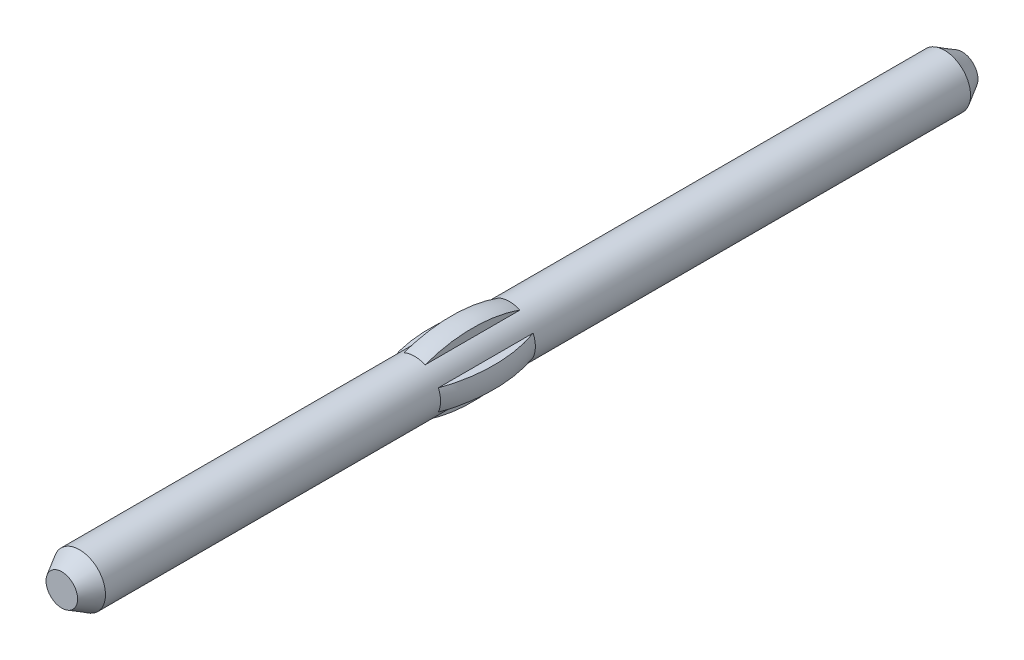
ISO-10303-21;
HEADER;
FILE_DESCRIPTION(('STEP AP214'),'2;1');
FILE_NAME('part.step','',(''),(''),'','','');
FILE_SCHEMA(('AUTOMOTIVE_DESIGN { 1 0 10303 214 1 1 1 1 }'));
ENDSEC;
DATA;
#1=APPLICATION_CONTEXT('core data for automotive mechanical design processes');
#2=APPLICATION_PROTOCOL_DEFINITION('international standard','automotive_design',2000,#1);
#3=PRODUCT_CONTEXT('',#1,'mechanical');
#4=PRODUCT('Part','Part','',(#3));
#5=PRODUCT_RELATED_PRODUCT_CATEGORY('part','',(#4));
#6=PRODUCT_DEFINITION_FORMATION('','',#4);
#7=PRODUCT_DEFINITION_CONTEXT('part definition',#1,'design');
#8=PRODUCT_DEFINITION('design','',#6,#7);
#9=PRODUCT_DEFINITION_SHAPE('','',#8);
#10=(LENGTH_UNIT() NAMED_UNIT(*) SI_UNIT(.MILLI.,.METRE.));
#11=(NAMED_UNIT(*) PLANE_ANGLE_UNIT() SI_UNIT($,.RADIAN.));
#12=(NAMED_UNIT(*) SI_UNIT($,.STERADIAN.) SOLID_ANGLE_UNIT());
#13=UNCERTAINTY_MEASURE_WITH_UNIT(LENGTH_MEASURE(1.E-05),#10,'distance_accuracy_value','');
#14=(GEOMETRIC_REPRESENTATION_CONTEXT(3) GLOBAL_UNCERTAINTY_ASSIGNED_CONTEXT((#13)) GLOBAL_UNIT_ASSIGNED_CONTEXT((#10,
#11,#12)) REPRESENTATION_CONTEXT('',''));
#15=CARTESIAN_POINT('',(0.,0.,0.));
#16=DIRECTION('',(0.,0.,1.));
#17=DIRECTION('',(1.,0.,0.));
#18=AXIS2_PLACEMENT_3D('',#15,#16,#17);
#19=CARTESIAN_POINT('',(96.225905319361,108.90011364552,5.31278614958));
#20=DIRECTION('',(1.74845553146897E-07,-0.999999999999984,-4.37114091299593E-08));
#21=DIRECTION('',(0.,4.37114091299599E-08,-1.));
#22=AXIS2_PLACEMENT_3D('',#19,#20,#21);
#23=PLANE('',#22);
#24=CARTESIAN_POINT('',(96.2259053193604,108.900113791951,1.96278614958001));
#25=CARTESIAN_POINT('',(96.22590531936,108.900113805067,1.66278614958));
#26=CARTESIAN_POINT('',(96.22590531936,108.90011381818,1.36278614958));
#27=CARTESIAN_POINT('',(96.2259053193607,108.900113831291,1.06278614957979));
#28=(BOUNDED_CURVE() B_SPLINE_CURVE(3,(#24,#25,#26,#27),.UNSPECIFIED.,.F.,
.F.) B_SPLINE_CURVE_WITH_KNOTS((4,4),(0.,1.),
.UNSPECIFIED.) CURVE() GEOMETRIC_REPRESENTATION_ITEM() RATIONAL_B_SPLINE_CURVE((1.,1.,1.,1.)) REPRESENTATION_ITEM(''));
#29=CARTESIAN_POINT('',(96.2259053193504,108.900113791954,1.96278614957638));
#30=VERTEX_POINT('',#29);
#31=CARTESIAN_POINT('',(96.2259053193456,108.900113831295,1.0627861495853));
#32=VERTEX_POINT('',#31);
#33=EDGE_CURVE('E28',#30,#32,#28,.T.);
#34=ORIENTED_EDGE('',*,*,#33,.T.);
#35=CARTESIAN_POINT('',(96.2259053193448,108.900113831293,1.06278614958558));
#36=CARTESIAN_POINT('',(96.2367600853112,108.900113831888,1.09260813590346));
#37=CARTESIAN_POINT('',(96.2464601385901,108.900113832263,1.12283126490756));
#38=CARTESIAN_POINT('',(96.2635854640539,108.900113832587,1.18390823471383));
#39=CARTESIAN_POINT('',(96.2710112975785,108.900113832537,1.21476191786905));
#40=CARTESIAN_POINT('',(96.2899430468077,108.900113831769,1.30806587721575));
#41=CARTESIAN_POINT('',(96.2980921656266,108.900113830433,1.37122817609962));
#42=CARTESIAN_POINT('',(96.3054365590262,108.900113826177,1.49797331769546));
#43=CARTESIAN_POINT('',(96.3046404848963,108.900113823258,1.56155569464625));
#44=CARTESIAN_POINT('',(96.2941234025157,108.900113815895,1.68792604610423));
#45=CARTESIAN_POINT('',(96.2844155328806,108.900113811453,1.75071505216087));
#46=CARTESIAN_POINT('',(96.2643935869055,108.90011380414,1.83792743388448));
#47=CARTESIAN_POINT('',(96.2577787954918,108.900113801877,1.86324096945574));
#48=CARTESIAN_POINT('',(96.243005887126,108.900113797102,1.91338924516118));
#49=CARTESIAN_POINT('',(96.2348491111923,108.900113794591,1.93822438081877));
#50=CARTESIAN_POINT('',(96.22590531935,108.900113791953,1.96278614957624));
#51=B_SPLINE_CURVE_WITH_KNOTS('',3,(#35,#36,#37,#38,#39,#40,#41,#42,#43,#44,#45,#46,#47,#48,#49,
#50),.UNSPECIFIED.,.F.,.F.,(4,2,2,2,2,2,2,4),(0.,0.0951523064873538,0.190281107811415,
0.38063618983316,0.570807186945313,0.760698265395729,0.839148426841913,0.917530673783877),.UNSPECIFIED.);
#52=EDGE_CURVE('E11',#32,#30,#51,.T.);
#53=ORIENTED_EDGE('',*,*,#52,.T.);
#54=EDGE_LOOP('',(#34,#53));
#55=FACE_BOUND('',#54,.T.);
#56=ADVANCED_FACE('F17',(#55),#23,.T.);
#57=CARTESIAN_POINT('',(96.0000535805985,109.000113772118,1.51278615395875));
#58=DIRECTION('',(-1.31218786265574E-12,4.37095438395527E-08,-1.));
#59=DIRECTION('',(0.,1.,4.37095438395528E-08));
#60=AXIS2_PLACEMENT_3D('',#57,#58,#59);
#61=DEGENERATE_TOROIDAL_SURFACE('',#60,1.10348630137945,1.42348630136758,.F.);
#62=CARTESIAN_POINT('',(96.0000535805979,109.000113791787,1.06278615395839));
#63=DIRECTION('',(-1.31218786265574E-12,4.37095438395527E-08,-1.));
#64=DIRECTION('',(0.,0.999999999999999,4.37095438395527E-08));
#65=AXIS2_PLACEMENT_3D('',#62,#63,#64);
#66=CIRCLE('',#65,0.246999999987888);
#67=CARTESIAN_POINT('',(96.225905284365,109.100113831287,1.06278615833173));
#68=VERTEX_POINT('',#67);
#69=EDGE_CURVE('E43',#32,#68,#66,.F.);
#70=ORIENTED_EDGE('',*,*,#69,.T.);
#71=CARTESIAN_POINT('',(96.2259052843625,109.100113831293,1.06278615833265));
#72=CARTESIAN_POINT('',(96.2367600503295,109.100113831888,1.0926081446507));
#73=CARTESIAN_POINT('',(96.246460103609,109.100113832263,1.12283127365503));
#74=CARTESIAN_POINT('',(96.2635854290736,109.100113832587,1.18390824346185));
#75=CARTESIAN_POINT('',(96.2710112625985,109.100113832537,1.21476192661739));
#76=CARTESIAN_POINT('',(96.2899430118284,109.100113831769,1.30806588596514));
#77=CARTESIAN_POINT('',(96.2980921306474,109.100113830433,1.37122818484981));
#78=CARTESIAN_POINT('',(96.3054365240467,109.100113826177,1.49797332644717));
#79=CARTESIAN_POINT('',(96.3046404499162,109.100113823258,1.56155570339868));
#80=CARTESIAN_POINT('',(96.2941233675343,109.100113815895,1.68792605485795));
#81=CARTESIAN_POINT('',(96.2844154978982,109.100113811453,1.75071506091516));
#82=CARTESIAN_POINT('',(96.2643935519221,109.10011380414,1.83792744263628));
#83=CARTESIAN_POINT('',(96.2577787605086,109.100113801877,1.86324097820467));
#84=CARTESIAN_POINT('',(96.2430058521437,109.100113797102,1.91338925390439));
#85=CARTESIAN_POINT('',(96.2348490762105,109.100113794591,1.93822438955915));
#86=CARTESIAN_POINT('',(96.2259052843689,109.100113791953,1.9627861583138));
#87=B_SPLINE_CURVE_WITH_KNOTS('',3,(#71,#72,#73,#74,#75,#76,#77,#78,#79,#80,#81,#82,#83,#84,#85,
#86),.UNSPECIFIED.,.F.,.F.,(4,2,2,2,2,2,2,4),(0.,0.0951523064884941,0.190281107813681,
0.380636189837757,0.57080718695203,0.760698265404483,0.839148426842087,0.917530673775471),.UNSPECIFIED.);
#88=CARTESIAN_POINT('',(96.2259052843711,109.100113791948,1.96278615831458));
#89=VERTEX_POINT('',#88);
#90=EDGE_CURVE('E176',#68,#89,#87,.T.);
#91=ORIENTED_EDGE('',*,*,#90,.T.);
#92=CARTESIAN_POINT('',(96.0000535805991,109.000113752449,1.9627861539447));
#93=DIRECTION('',(-1.31218786265574E-12,4.37095438395527E-08,-1.));
#94=DIRECTION('',(0.,0.999999999999999,4.37095438395527E-08));
#95=AXIS2_PLACEMENT_3D('',#92,#93,#94);
#96=CIRCLE('',#95,0.246999999992688);
#97=EDGE_CURVE('E297',#89,#30,#96,.T.);
#98=ORIENTED_EDGE('',*,*,#97,.T.);
#99=ORIENTED_EDGE('',*,*,#52,.F.);
#100=EDGE_LOOP('',(#70,#91,#98,#99));
#101=FACE_BOUND('',#100,.T.);
#102=ADVANCED_FACE('F183',(#101),#61,.F.);
#103=CARTESIAN_POINT('',(96.225905284391,109.10011364552,5.312786158322));
#104=DIRECTION('',(1.74845553146897E-07,-0.999999999999984,-4.37114091299593E-08));
#105=DIRECTION('',(0.,4.37114091299599E-08,-1.));
#106=AXIS2_PLACEMENT_3D('',#103,#104,#105);
#107=PLANE('',#106);
#108=ORIENTED_EDGE('',*,*,#90,.F.);
#109=CARTESIAN_POINT('',(96.2259052843906,109.10011379195,1.9627861583217));
#110=CARTESIAN_POINT('',(96.225905284391,109.100113805067,1.662786158322));
#111=CARTESIAN_POINT('',(96.225905284391,109.10011381818,1.362786158322));
#112=CARTESIAN_POINT('',(96.2259052843908,109.100113831291,1.06278615832233));
#113=(BOUNDED_CURVE() B_SPLINE_CURVE(3,(#109,#110,#111,#112),.UNSPECIFIED.,.F.,
.F.) B_SPLINE_CURVE_WITH_KNOTS((4,4),(0.,1.),
.UNSPECIFIED.) CURVE() GEOMETRIC_REPRESENTATION_ITEM() RATIONAL_B_SPLINE_CURVE((1.,1.,1.,1.)) REPRESENTATION_ITEM(''));
#114=EDGE_CURVE('E301',#89,#68,#113,.T.);
#115=ORIENTED_EDGE('',*,*,#114,.F.);
#116=EDGE_LOOP('',(#108,#115));
#117=FACE_BOUND('',#116,.T.);
#118=ADVANCED_FACE('F186',(#117),#107,.F.);
#119=CARTESIAN_POINT('',(96.000053580607,109.00011358734,5.740286153951));
#120=DIRECTION('',(0.,4.37114091299598E-08,-1.));
#121=DIRECTION('',(-0.999999999999985,-1.74845574366145E-07,0.));
#122=AXIS2_PLACEMENT_3D('',#119,#120,#121);
#123=CYLINDRICAL_SURFACE('',#122,0.247);
#124=ORIENTED_EDGE('',*,*,#69,.F.);
#125=ORIENTED_EDGE('',*,*,#33,.F.);
#126=ORIENTED_EDGE('',*,*,#97,.F.);
#127=ORIENTED_EDGE('',*,*,#114,.T.);
#128=EDGE_LOOP('',(#124,#125,#126,#127));
#129=FACE_BOUND('',#128,.T.);
#130=CARTESIAN_POINT('',(96.0000535806069,109.000113972415,-3.069204917715));
#131=DIRECTION('',(0.,4.37114091299598E-08,-1.));
#132=DIRECTION('',(0.,0.999999999999999,4.37114091299598E-08));
#133=AXIS2_PLACEMENT_3D('',#130,#131,#132);
#134=CIRCLE('',#133,0.247);
#135=CARTESIAN_POINT('',(96.0000535806069,109.247113972415,-3.06920490691828));
#136=VERTEX_POINT('',#135);
#137=EDGE_CURVE('E131',#136,#136,#134,.F.);
#138=ORIENTED_EDGE('',*,*,#137,.T.);
#139=EDGE_LOOP('',(#138));
#140=FACE_BOUND('',#139,.T.);
#141=CARTESIAN_POINT('',(96.000053580607,109.00011375246,1.9627861539508));
#142=DIRECTION('',(0.,4.37114091299598E-08,-1.));
#143=DIRECTION('',(0.,0.999999999999999,4.37114091299598E-08));
#144=AXIS2_PLACEMENT_3D('',#141,#142,#143);
#145=CIRCLE('',#144,0.247);
#146=CARTESIAN_POINT('',(95.7742018418576,109.100113712972,1.96278615832066));
#147=VERTEX_POINT('',#146);
#148=CARTESIAN_POINT('',(95.7742018768222,108.900113712972,1.96278614957984));
#149=VERTEX_POINT('',#148);
#150=EDGE_CURVE('E104',#147,#149,#145,.F.);
#151=ORIENTED_EDGE('',*,*,#150,.T.);
#152=CARTESIAN_POINT('',(95.7742018768225,108.900113712971,1.96278614958012));
#153=CARTESIAN_POINT('',(95.774201876823,108.900113726087,1.66278614958));
#154=CARTESIAN_POINT('',(95.774201876823,108.9001137392,1.36278614958));
#155=CARTESIAN_POINT('',(95.774201876823,108.900113752311,1.06278614957994));
#156=(BOUNDED_CURVE() B_SPLINE_CURVE(3,(#152,#153,#154,#155),.UNSPECIFIED.,.F.,
.F.) B_SPLINE_CURVE_WITH_KNOTS((4,4),(0.,1.),
.UNSPECIFIED.) CURVE() GEOMETRIC_REPRESENTATION_ITEM() RATIONAL_B_SPLINE_CURVE((1.,1.,1.,1.)) REPRESENTATION_ITEM(''));
#157=CARTESIAN_POINT('',(95.7742018768224,108.900113752312,1.06278614957993));
#158=VERTEX_POINT('',#157);
#159=EDGE_CURVE('E118',#149,#158,#156,.T.);
#160=ORIENTED_EDGE('',*,*,#159,.T.);
#161=CARTESIAN_POINT('',(96.000053580607,109.0001137918,1.062786153951));
#162=DIRECTION('',(0.,4.37114091299598E-08,-1.));
#163=DIRECTION('',(0.,0.999999999999999,4.37114091299598E-08));
#164=AXIS2_PLACEMENT_3D('',#161,#162,#163);
#165=CIRCLE('',#164,0.247);
#166=CARTESIAN_POINT('',(95.7742018418601,109.100113752313,1.06278615832432));
#167=VERTEX_POINT('',#166);
#168=EDGE_CURVE('E112',#158,#167,#165,.T.);
#169=ORIENTED_EDGE('',*,*,#168,.T.);
#170=CARTESIAN_POINT('',(95.7742018418537,109.100113752312,1.062786158322));
#171=CARTESIAN_POINT('',(95.774201841854,109.1001137392,1.362786158322));
#172=CARTESIAN_POINT('',(95.774201841854,109.100113726087,1.662786158322));
#173=CARTESIAN_POINT('',(95.7742018418542,109.100113712971,1.96278615832194));
#174=(BOUNDED_CURVE() B_SPLINE_CURVE(3,(#170,#171,#172,#173),.UNSPECIFIED.,.F.,
.F.) B_SPLINE_CURVE_WITH_KNOTS((4,4),(-1.,0.),
.UNSPECIFIED.) CURVE() GEOMETRIC_REPRESENTATION_ITEM() RATIONAL_B_SPLINE_CURVE((1.,1.,1.,1.)) REPRESENTATION_ITEM(''));
#175=EDGE_CURVE('E116',#167,#147,#174,.T.);
#176=ORIENTED_EDGE('',*,*,#175,.T.);
#177=EDGE_LOOP('',(#151,#160,#169,#176));
#178=FACE_BOUND('',#177,.T.);
#179=CARTESIAN_POINT('',(96.100053541118,109.225965530552,1.06278616382319));
#180=CARTESIAN_POINT('',(96.1000535411182,109.225965517437,1.362786163823));
#181=CARTESIAN_POINT('',(96.1000535411182,109.225965504323,1.662786163823));
#182=CARTESIAN_POINT('',(96.1000535411176,109.225965491211,1.96278616382265));
#183=(BOUNDED_CURVE() B_SPLINE_CURVE(3,(#179,#180,#181,#182),.UNSPECIFIED.,.F.,
.F.) B_SPLINE_CURVE_WITH_KNOTS((4,4),(0.,1.),
.UNSPECIFIED.) CURVE() GEOMETRIC_REPRESENTATION_ITEM() RATIONAL_B_SPLINE_CURVE((1.,1.,1.,1.)) REPRESENTATION_ITEM(''));
#184=CARTESIAN_POINT('',(96.1000535411181,109.225965530553,1.06278616382302));
#185=VERTEX_POINT('',#184);
#186=CARTESIAN_POINT('',(96.100053541118,109.225965491212,1.96278616382265));
#187=VERTEX_POINT('',#186);
#188=EDGE_CURVE('E158',#185,#187,#183,.T.);
#189=ORIENTED_EDGE('',*,*,#188,.T.);
#190=CARTESIAN_POINT('',(96.000053580607,109.00011375246,1.96278615395035));
#191=DIRECTION('',(0.,4.37114091299598E-08,-1.));
#192=DIRECTION('',(0.,0.999999999999999,4.37114091299598E-08));
#193=AXIS2_PLACEMENT_3D('',#190,#191,#192);
#194=CIRCLE('',#193,0.247);
#195=CARTESIAN_POINT('',(95.9000535411182,109.225965456236,1.96278616382043));
#196=VERTEX_POINT('',#195);
#197=EDGE_CURVE('E166',#187,#196,#194,.F.);
#198=ORIENTED_EDGE('',*,*,#197,.T.);
#199=CARTESIAN_POINT('',(95.9000535411175,109.225965456241,1.96278616382298));
#200=CARTESIAN_POINT('',(95.9000535411182,109.225965469353,1.662786163823));
#201=CARTESIAN_POINT('',(95.9000535411182,109.225965482467,1.362786163823));
#202=CARTESIAN_POINT('',(95.900053541117,109.225965495582,1.06278616382285));
#203=(BOUNDED_CURVE() B_SPLINE_CURVE(3,(#199,#200,#201,#202),.UNSPECIFIED.,.F.,
.F.) B_SPLINE_CURVE_WITH_KNOTS((4,4),(-1.,0.),
.UNSPECIFIED.) CURVE() GEOMETRIC_REPRESENTATION_ITEM() RATIONAL_B_SPLINE_CURVE((1.,1.,1.,1.)) REPRESENTATION_ITEM(''));
#204=CARTESIAN_POINT('',(95.9000535411182,109.225965495573,1.06278616382646));
#205=VERTEX_POINT('',#204);
#206=EDGE_CURVE('E148',#196,#205,#203,.T.);
#207=ORIENTED_EDGE('',*,*,#206,.T.);
#208=CARTESIAN_POINT('',(96.000053580607,109.0001137918,1.06278615395055));
#209=DIRECTION('',(0.,4.37114091299598E-08,-1.));
#210=DIRECTION('',(0.,0.999999999999999,4.37114091299598E-08));
#211=AXIS2_PLACEMENT_3D('',#208,#209,#210);
#212=CIRCLE('',#211,0.247);
#213=EDGE_CURVE('E255',#205,#185,#212,.T.);
#214=ORIENTED_EDGE('',*,*,#213,.T.);
#215=EDGE_LOOP('',(#189,#198,#207,#214));
#216=FACE_BOUND('',#215,.T.);
#217=CARTESIAN_POINT('',(96.000053580607,109.000113613371,5.14477722561698));
#218=DIRECTION('',(0.,4.37114091299598E-08,-1.));
#219=DIRECTION('',(0.,0.999999999999999,4.37114091299598E-08));
#220=AXIS2_PLACEMENT_3D('',#217,#218,#219);
#221=CIRCLE('',#220,0.247);
#222=CARTESIAN_POINT('',(96.000053580607,109.247113613371,5.1447772364137));
#223=VERTEX_POINT('',#222);
#224=EDGE_CURVE('E127',#223,#223,#221,.T.);
#225=ORIENTED_EDGE('',*,*,#224,.T.);
#226=EDGE_LOOP('',(#225));
#227=FACE_BOUND('',#226,.T.);
#228=CARTESIAN_POINT('',(96.1000536200969,108.774262048678,1.96278614407898));
#229=CARTESIAN_POINT('',(96.1000536200967,108.774262061793,1.662786144079));
#230=CARTESIAN_POINT('',(96.1000536200967,108.774262074907,1.362786144079));
#231=CARTESIAN_POINT('',(96.1000536200973,108.774262088017,1.06278614407837));
#232=(BOUNDED_CURVE() B_SPLINE_CURVE(3,(#228,#229,#230,#231),.UNSPECIFIED.,.F.,
.F.) B_SPLINE_CURVE_WITH_KNOTS((4,4),(-1.,0.),
.UNSPECIFIED.) CURVE() GEOMETRIC_REPRESENTATION_ITEM() RATIONAL_B_SPLINE_CURVE((1.,1.,1.,1.)) REPRESENTATION_ITEM(''));
#233=CARTESIAN_POINT('',(96.1000536200967,108.774262048677,1.9627861440788));
#234=VERTEX_POINT('',#233);
#235=CARTESIAN_POINT('',(96.1000536200967,108.77426208802,1.06278614407944));
#236=VERTEX_POINT('',#235);
#237=EDGE_CURVE('E317',#234,#236,#232,.T.);
#238=ORIENTED_EDGE('',*,*,#237,.T.);
#239=CARTESIAN_POINT('',(96.000053580607,109.0001137918,1.06278615395066));
#240=DIRECTION('',(0.,4.37114091299598E-08,-1.));
#241=DIRECTION('',(0.,0.999999999999999,4.37114091299598E-08));
#242=AXIS2_PLACEMENT_3D('',#239,#240,#241);
#243=CIRCLE('',#242,0.247);
#244=CARTESIAN_POINT('',(95.9000536200962,108.774262053047,1.06278614407841));
#245=VERTEX_POINT('',#244);
#246=EDGE_CURVE('E334',#236,#245,#243,.T.);
#247=ORIENTED_EDGE('',*,*,#246,.T.);
#248=CARTESIAN_POINT('',(95.9000536200957,108.774262053047,1.06278614407846));
#249=CARTESIAN_POINT('',(95.9000536200967,108.774262039937,1.362786144079));
#250=CARTESIAN_POINT('',(95.9000536200967,108.774262026823,1.662786144079));
#251=CARTESIAN_POINT('',(95.9000536200963,108.774262013709,1.96278614407884));
#252=(BOUNDED_CURVE() B_SPLINE_CURVE(3,(#248,#249,#250,#251),.UNSPECIFIED.,.F.,
.F.) B_SPLINE_CURVE_WITH_KNOTS((4,4),(0.,1.),
.UNSPECIFIED.) CURVE() GEOMETRIC_REPRESENTATION_ITEM() RATIONAL_B_SPLINE_CURVE((1.,1.,1.,1.)) REPRESENTATION_ITEM(''));
#253=CARTESIAN_POINT('',(95.9000536200965,108.774262013708,1.96278614407884));
#254=VERTEX_POINT('',#253);
#255=EDGE_CURVE('E218',#245,#254,#252,.T.);
#256=ORIENTED_EDGE('',*,*,#255,.T.);
#257=CARTESIAN_POINT('',(96.000053580607,109.00011375246,1.96278615395113));
#258=DIRECTION('',(0.,4.37114091299598E-08,-1.));
#259=DIRECTION('',(0.,0.999999999999999,4.37114091299598E-08));
#260=AXIS2_PLACEMENT_3D('',#257,#258,#259);
#261=CIRCLE('',#260,0.247);
#262=EDGE_CURVE('E309',#254,#234,#261,.F.);
#263=ORIENTED_EDGE('',*,*,#262,.T.);
#264=EDGE_LOOP('',(#238,#247,#256,#263));
#265=FACE_BOUND('',#264,.T.);
#266=ADVANCED_FACE('F113',(#129,#140,#178,#216,#227,#265),#123,.T.);
#267=CARTESIAN_POINT('',(96.0000535805985,109.000113772118,1.51278615395875));
#268=DIRECTION('',(-1.31218786265574E-12,4.37095438395527E-08,-1.));
#269=DIRECTION('',(0.,1.,4.37095438395528E-08));
#270=AXIS2_PLACEMENT_3D('',#267,#268,#269);
#271=DEGENERATE_TOROIDAL_SURFACE('',#270,1.10348630137945,1.42348630136758,.F.);
#272=ORIENTED_EDGE('',*,*,#246,.F.);
#273=CARTESIAN_POINT('',(96.1000536200967,108.774262088023,1.06278614408051));
#274=CARTESIAN_POINT('',(96.1000536219946,108.763407320752,1.09260812992353));
#275=CARTESIAN_POINT('',(96.1000536236906,108.753707266152,1.12283125850329));
#276=CARTESIAN_POINT('',(96.1000536266849,108.736581938018,1.18390822756036));
#277=CARTESIAN_POINT('',(96.1000536279833,108.729156103144,1.21476191039071));
#278=CARTESIAN_POINT('',(96.1000536312934,108.710224349836,1.30806586890907));
#279=CARTESIAN_POINT('',(96.1000536327182,108.702075228256,1.37122816743628));
#280=CARTESIAN_POINT('',(96.1000536340024,108.694730829315,1.49797330871015));
#281=CARTESIAN_POINT('',(96.1000536338632,108.695526900666,1.56155568569527));
#282=CARTESIAN_POINT('',(96.1000536320243,108.706043977522,1.68792603761203));
#283=CARTESIAN_POINT('',(96.100053630327,108.715751844412,1.75071504409257));
#284=CARTESIAN_POINT('',(96.1000536268262,108.735773786576,1.83792742669329));
#285=CARTESIAN_POINT('',(96.1000536256696,108.742388576884,1.86324096255605));
#286=CARTESIAN_POINT('',(96.1000536230867,108.757161483059,1.91338923891183));
#287=CARTESIAN_POINT('',(96.1000536216605,108.765318257909,1.9382243749282));
#288=CARTESIAN_POINT('',(96.1000536200967,108.774262048679,1.96278614407877));
#289=B_SPLINE_CURVE_WITH_KNOTS('',3,(#273,#274,#275,#276,#277,#278,#279,#280,#281,#282,#283,
#284,#285,#286,#287,#288),.UNSPECIFIED.,.F.,.F.,(4,2,2,2,2,2,2,4),(0.,0.0951523064867371,
0.190281107810166,0.38063618983065,0.570807186941363,0.760698265390336,0.839148426843927,
0.917530673793298),.UNSPECIFIED.);
#290=EDGE_CURVE('E203',#236,#234,#289,.T.);
#291=ORIENTED_EDGE('',*,*,#290,.T.);
#292=ORIENTED_EDGE('',*,*,#262,.F.);
#293=CARTESIAN_POINT('',(95.9000536200967,108.774262013703,1.96278614408111));
#294=CARTESIAN_POINT('',(95.9000536219946,108.76340724904,1.93296415728829));
#295=CARTESIAN_POINT('',(95.9000536236906,108.753707197082,1.9027410278597));
#296=CARTESIAN_POINT('',(95.9000536266849,108.736581874288,1.84166405730387));
#297=CARTESIAN_POINT('',(95.9000536279833,108.729156042112,1.81081037382355));
#298=CARTESIAN_POINT('',(95.9000536312934,108.710224296961,1.71750641364777));
#299=CARTESIAN_POINT('',(95.9000536327182,108.702075180903,1.65434411440662));
#300=CARTESIAN_POINT('',(95.9000536340024,108.694730793045,1.52759897248772));
#301=CARTESIAN_POINT('',(95.9000536338632,108.695526869955,1.46401659557074));
#302=CARTESIAN_POINT('',(95.9000536320243,108.706043957861,1.33764624457066));
#303=CARTESIAN_POINT('',(95.9000536303269,108.715751830242,1.27485723893752));
#304=CARTESIAN_POINT('',(95.9000536268262,108.73577378003,1.1876448580882));
#305=CARTESIAN_POINT('',(95.9000536256696,108.742388572551,1.16233132280592));
#306=CARTESIAN_POINT('',(95.9000536230866,108.75716148311,1.11218304774595));
#307=CARTESIAN_POINT('',(95.9000536216605,108.76531826013,1.08734791244478));
#308=CARTESIAN_POINT('',(95.9000536200967,108.774262053046,1.06278614407818));
#309=B_SPLINE_CURVE_WITH_KNOTS('',3,(#293,#294,#295,#296,#297,#298,#299,#300,#301,#302,#303,
#304,#305,#306,#307,#308),.UNSPECIFIED.,.F.,.F.,(4,2,2,2,2,2,2,4),(0.,0.0951523064888302,
0.190281107814374,0.380636189839102,0.570807186954181,0.760698265407497,0.839148426854501,
0.917530673797292),.UNSPECIFIED.);
#310=EDGE_CURVE('E121',#254,#245,#309,.T.);
#311=ORIENTED_EDGE('',*,*,#310,.T.);
#312=EDGE_LOOP('',(#272,#291,#292,#311));
#313=FACE_BOUND('',#312,.T.);
#314=ADVANCED_FACE('F193',(#313),#271,.F.);
#315=CARTESIAN_POINT('',(96.100053633756,108.69613994044,5.312786140664));
#316=DIRECTION('',(0.999999999999985,1.74845553146897E-07,0.));
#317=DIRECTION('',(0.,0.,-1.));
#318=AXIS2_PLACEMENT_3D('',#315,#316,#317);
#319=PLANE('',#318);
#320=ORIENTED_EDGE('',*,*,#237,.F.);
#321=ORIENTED_EDGE('',*,*,#290,.F.);
#322=EDGE_LOOP('',(#320,#321));
#323=FACE_BOUND('',#322,.T.);
#324=ADVANCED_FACE('F197',(#323),#319,.T.);
#325=CARTESIAN_POINT('',(95.900053633756,108.69613990547,5.312786140664));
#326=DIRECTION('',(0.999999999999985,1.74845553146897E-07,0.));
#327=DIRECTION('',(0.,0.,-1.));
#328=AXIS2_PLACEMENT_3D('',#325,#326,#327);
#329=PLANE('',#328);
#330=ORIENTED_EDGE('',*,*,#310,.F.);
#331=ORIENTED_EDGE('',*,*,#255,.F.);
#332=EDGE_LOOP('',(#330,#331));
#333=FACE_BOUND('',#332,.T.);
#334=ADVANCED_FACE('F220',(#333),#329,.F.);
#335=CARTESIAN_POINT('',(96.0000535805985,109.000113772118,1.51278615395875));
#336=DIRECTION('',(-1.31218786265574E-12,4.37095438395527E-08,-1.));
#337=DIRECTION('',(0.,1.,4.37095438395528E-08));
#338=AXIS2_PLACEMENT_3D('',#335,#336,#337);
#339=DEGENERATE_TOROIDAL_SURFACE('',#338,1.10348630137945,1.42348630136758,.F.);
#340=ORIENTED_EDGE('',*,*,#150,.F.);
#341=CARTESIAN_POINT('',(95.7742018418612,109.100113712973,1.96278615831938));
#342=CARTESIAN_POINT('',(95.7633470758943,109.100113712379,1.93296417200081));
#343=CARTESIAN_POINT('',(95.753647022615,109.100113712004,1.90274104299597));
#344=CARTESIAN_POINT('',(95.7365216971508,109.100113711679,1.84166407318814));
#345=CARTESIAN_POINT('',(95.7290958636261,109.10011371173,1.8108103900321));
#346=CARTESIAN_POINT('',(95.7101641143969,109.100113712498,1.71750643068285));
#347=CARTESIAN_POINT('',(95.7020149955784,109.100113713834,1.65434413179719));
#348=CARTESIAN_POINT('',(95.6946706021805,109.10011371809,1.52759899019795));
#349=CARTESIAN_POINT('',(95.6954666763117,109.100113721009,1.46401661324553));
#350=CARTESIAN_POINT('',(95.7059837586955,109.100113728371,1.3376462617846));
#351=CARTESIAN_POINT('',(95.7156916283325,109.100113732813,1.27485725572662));
#352=CARTESIAN_POINT('',(95.7357135743103,109.100113740126,1.18764487400467));
#353=CARTESIAN_POINT('',(95.7423283657242,109.100113742389,1.16233133843611));
#354=CARTESIAN_POINT('',(95.7571012740901,109.100113747164,1.11218306273611));
#355=CARTESIAN_POINT('',(95.7652580500238,109.100113749676,1.08734792708122));
#356=CARTESIAN_POINT('',(95.7742018418659,109.100113752313,1.06278615832646));
#357=B_SPLINE_CURVE_WITH_KNOTS('',3,(#341,#342,#343,#344,#345,#346,#347,#348,#349,#350,#351,
#352,#353,#354,#355,#356),.UNSPECIFIED.,.F.,.F.,(4,2,2,2,2,2,2,4),(0.,0.0951523064898039,
0.190281107816306,0.380636189843072,0.570807186960068,0.76069826541521,0.839148426853649,
0.917530673787884),.UNSPECIFIED.);
#358=EDGE_CURVE('E123',#147,#167,#357,.T.);
#359=ORIENTED_EDGE('',*,*,#358,.T.);
#360=ORIENTED_EDGE('',*,*,#168,.F.);
#361=CARTESIAN_POINT('',(95.7742018768231,108.900113752314,1.06278614957998));
#362=CARTESIAN_POINT('',(95.7633471108568,108.900113749112,1.09260813589747));
#363=CARTESIAN_POINT('',(95.7536470575778,108.900113746095,1.12283126490118));
#364=CARTESIAN_POINT('',(95.736521732114,108.900113740431,1.18390823470667));
#365=CARTESIAN_POINT('',(95.7290958985894,108.900113737784,1.21476191786149));
#366=CARTESIAN_POINT('',(95.7101641493599,108.900113730395,1.308065877207));
#367=CARTESIAN_POINT('',(95.7020150305408,108.900113726209,1.37122817609008));
#368=CARTESIAN_POINT('',(95.6946706371405,108.900113719385,1.49797331768436));
#369=CARTESIAN_POINT('',(95.6954667112701,108.900113716745,1.56155569463439));
#370=CARTESIAN_POINT('',(95.7059837936497,108.90011371306,1.68792604609093));
#371=CARTESIAN_POINT('',(95.7156916632842,108.900113712013,1.7507150521469));
#372=CARTESIAN_POINT('',(95.735713609259,108.900113711701,1.83792743387327));
#373=CARTESIAN_POINT('',(95.7423284006735,108.900113711752,1.86324096944785));
#374=CARTESIAN_POINT('',(95.7571013090411,108.900113712142,1.91338924515981));
#375=CARTESIAN_POINT('',(95.765258084976,108.900113712483,1.9382243808206));
#376=CARTESIAN_POINT('',(95.7742018768196,108.900113712973,1.96278614958119));
#377=B_SPLINE_CURVE_WITH_KNOTS('',3,(#361,#362,#363,#364,#365,#366,#367,#368,#369,#370,#371,
#372,#373,#374,#375,#376),.UNSPECIFIED.,.F.,.F.,(4,2,2,2,2,2,2,4),(0.,0.0951523064862405,
0.190281107809192,0.380636189828669,0.570807186938538,0.760698265386713,0.839148426843073,
0.917530673795204),.UNSPECIFIED.);
#378=EDGE_CURVE('E248',#158,#149,#377,.T.);
#379=ORIENTED_EDGE('',*,*,#378,.T.);
#380=EDGE_LOOP('',(#340,#359,#360,#379));
#381=FACE_BOUND('',#380,.T.);
#382=ADVANCED_FACE('F124',(#381),#339,.F.);
#383=CARTESIAN_POINT('',(95.774201876823,108.90011356654,5.31278614958));
#384=DIRECTION('',(-1.74845553146897E-07,0.999999999999984,4.37114091299593E-08));
#385=DIRECTION('',(0.242535733883495,0.,0.970142472933535));
#386=AXIS2_PLACEMENT_3D('',#383,#384,#385);
#387=PLANE('',#386);
#388=ORIENTED_EDGE('',*,*,#378,.F.);
#389=ORIENTED_EDGE('',*,*,#159,.F.);
#390=EDGE_LOOP('',(#388,#389));
#391=FACE_BOUND('',#390,.T.);
#392=ADVANCED_FACE('F239',(#391),#387,.F.);
#393=CARTESIAN_POINT('',(96.0000535805985,109.000113772118,1.51278615395875));
#394=DIRECTION('',(-1.31218786265574E-12,4.37095438395527E-08,-1.));
#395=DIRECTION('',(0.,1.,4.37095438395528E-08));
#396=AXIS2_PLACEMENT_3D('',#393,#394,#395);
#397=DEGENERATE_TOROIDAL_SURFACE('',#396,1.10348630137945,1.42348630136758,.F.);
#398=ORIENTED_EDGE('',*,*,#197,.F.);
#399=CARTESIAN_POINT('',(96.1000535411183,109.225965491191,1.96278616381523));
#400=CARTESIAN_POINT('',(96.1000535392204,109.236820258461,1.93296417797078));
#401=CARTESIAN_POINT('',(96.1000535375243,109.246520313061,1.90274104938958));
#402=CARTESIAN_POINT('',(96.10005353453,109.263645641195,1.84166408032963));
#403=CARTESIAN_POINT('',(96.1000535332317,109.271071476068,1.81081039749785));
#404=CARTESIAN_POINT('',(96.1000535299215,109.290003229375,1.71750643897516));
#405=CARTESIAN_POINT('',(96.1000535284967,109.298152350954,1.65434414044508));
#406=CARTESIAN_POINT('',(96.1000535272126,109.305496749891,1.52759899916569));
#407=CARTESIAN_POINT('',(96.1000535273517,109.304700678538,1.46401662217792));
#408=CARTESIAN_POINT('',(96.1000535291906,109.294183601677,1.33764627025626));
#409=CARTESIAN_POINT('',(96.100053530888,109.284475734783,1.27485726377349));
#410=CARTESIAN_POINT('',(96.1000535343887,109.264453792618,1.18764488117904));
#411=CARTESIAN_POINT('',(96.1000535355453,109.257839002311,1.16233134532441));
#412=CARTESIAN_POINT('',(96.1000535381283,109.243066096139,1.11218306898465));
#413=CARTESIAN_POINT('',(96.1000535395545,109.234909321291,1.08734793297617));
#414=CARTESIAN_POINT('',(96.1000535411182,109.225965530524,1.06278616383333));
#415=B_SPLINE_CURVE_WITH_KNOTS('',3,(#399,#400,#401,#402,#403,#404,#405,#406,#407,#408,#409,
#410,#411,#412,#413,#414),.UNSPECIFIED.,.F.,.F.,(4,2,2,2,2,2,2,4),(0.,0.0951523064906153,
0.190281107817931,0.380636189846345,0.57080718696503,0.760698265421833,0.83914842685094,
0.917530673775851),.UNSPECIFIED.);
#416=EDGE_CURVE('E167',#187,#185,#415,.T.);
#417=ORIENTED_EDGE('',*,*,#416,.T.);
#418=ORIENTED_EDGE('',*,*,#213,.F.);
#419=CARTESIAN_POINT('',(95.9000535411182,109.225965495562,1.06278616383007));
#420=CARTESIAN_POINT('',(95.9000535392203,109.236820260225,1.09260815062246));
#421=CARTESIAN_POINT('',(95.9000535375243,109.246520312183,1.12283128005062));
#422=CARTESIAN_POINT('',(95.90005353453,109.263645634977,1.18390825060559));
#423=CARTESIAN_POINT('',(95.9000535332317,109.271071467153,1.21476193408548));
#424=CARTESIAN_POINT('',(95.9000535299215,109.290003212304,1.30806589425995));
#425=CARTESIAN_POINT('',(95.9000535284967,109.298152328362,1.37122819350022));
#426=CARTESIAN_POINT('',(95.9000535272125,109.305496716222,1.49797333541745));
#427=CARTESIAN_POINT('',(95.9000535273517,109.304700639312,1.56155571233362));
#428=CARTESIAN_POINT('',(95.9000535291906,109.294183551408,1.68792606333219));
#429=CARTESIAN_POINT('',(95.900053530888,109.284475679028,1.75071506896462));
#430=CARTESIAN_POINT('',(95.9000535343887,109.26445372924,1.83792744981242));
#431=CARTESIAN_POINT('',(95.9000535355453,109.25783893672,1.86324098509381));
#432=CARTESIAN_POINT('',(95.9000535381283,109.243066026163,1.91338926015206));
#433=CARTESIAN_POINT('',(95.9000535395544,109.234909249144,1.9382243954524));
#434=CARTESIAN_POINT('',(95.9000535411182,109.225965456228,1.96278616381821));
#435=B_SPLINE_CURVE_WITH_KNOTS('',3,(#419,#420,#421,#422,#423,#424,#425,#426,#427,#428,#429,
#430,#431,#432,#433,#434),.UNSPECIFIED.,.F.,.F.,(4,2,2,2,2,2,2,4),(0.,0.0951523064876222,
0.19028110781195,0.380636189834248,0.570807186946907,0.760698265397808,0.839148426841802,
0.917530673781586),.UNSPECIFIED.);
#436=EDGE_CURVE('E157',#205,#196,#435,.T.);
#437=ORIENTED_EDGE('',*,*,#436,.T.);
#438=EDGE_LOOP('',(#398,#417,#418,#437));
#439=FACE_BOUND('',#438,.T.);
#440=ADVANCED_FACE('F243',(#439),#397,.F.);
#441=CARTESIAN_POINT('',(96.100053527459,109.30408730658,5.312786167238));
#442=DIRECTION('',(-0.999999999999985,-1.74845553146897E-07,0.));
#443=DIRECTION('',(-1.74845553146897E-07,0.999999999999985,0.));
#444=AXIS2_PLACEMENT_3D('',#441,#442,#443);
#445=PLANE('',#444);
#446=ORIENTED_EDGE('',*,*,#416,.F.);
#447=ORIENTED_EDGE('',*,*,#188,.F.);
#448=EDGE_LOOP('',(#446,#447));
#449=FACE_BOUND('',#448,.T.);
#450=ADVANCED_FACE('F274',(#449),#445,.F.);
#451=CARTESIAN_POINT('',(95.900053527459,109.30408727161,5.312786167238));
#452=DIRECTION('',(-0.999999999999985,-1.74845553146897E-07,0.));
#453=DIRECTION('',(-1.74845553146897E-07,0.999999999999985,0.));
#454=AXIS2_PLACEMENT_3D('',#451,#452,#453);
#455=PLANE('',#454);
#456=ORIENTED_EDGE('',*,*,#206,.F.);
#457=ORIENTED_EDGE('',*,*,#436,.F.);
#458=EDGE_LOOP('',(#456,#457));
#459=FACE_BOUND('',#458,.T.);
#460=ADVANCED_FACE('F284',(#459),#455,.T.);
#461=CARTESIAN_POINT('',(96.000053580607,109.0001136097,5.228781689784));
#462=DIRECTION('',(0.,4.37114091299598E-08,-1.));
#463=DIRECTION('',(-0.999999999999985,-1.74845584414418E-07,0.));
#464=AXIS2_PLACEMENT_3D('',#461,#462,#463);
#465=CONICAL_SURFACE('',#464,0.198499999999993,0.523598775598);
#466=CARTESIAN_POINT('',(96.000053580607,109.000113606028,5.31278591174531));
#467=DIRECTION('',(0.,4.37114091299598E-08,-1.));
#468=DIRECTION('',(0.,0.999999999999999,4.37114091299598E-08));
#469=AXIS2_PLACEMENT_3D('',#466,#467,#468);
#470=CIRCLE('',#469,0.150000139837597);
#471=CARTESIAN_POINT('',(96.000053580607,109.150113745866,5.31278591830203));
#472=VERTEX_POINT('',#471);
#473=EDGE_CURVE('E21',#472,#472,#470,.T.);
#474=ORIENTED_EDGE('',*,*,#473,.T.);
#475=EDGE_LOOP('',(#474));
#476=FACE_BOUND('',#475,.T.);
#477=ORIENTED_EDGE('',*,*,#224,.F.);
#478=EDGE_LOOP('',(#477));
#479=FACE_BOUND('',#478,.T.);
#480=ADVANCED_FACE('F373',(#476,#479),#465,.T.);
#481=CARTESIAN_POINT('',(95.774201841854,109.10011356654,5.312786158322));
#482=DIRECTION('',(-1.74845553146897E-07,0.999999999999984,4.37114091299593E-08));
#483=DIRECTION('',(0.242535733883495,0.,0.970142472933535));
#484=AXIS2_PLACEMENT_3D('',#481,#482,#483);
#485=PLANE('',#484);
#486=ORIENTED_EDGE('',*,*,#175,.F.);
#487=ORIENTED_EDGE('',*,*,#358,.F.);
#488=EDGE_LOOP('',(#486,#487));
#489=FACE_BOUND('',#488,.T.);
#490=ADVANCED_FACE('F129',(#489),#485,.T.);
#491=CARTESIAN_POINT('',(96.000053580607,109.00011397609,-3.153209381882));
#492=DIRECTION('',(0.,-4.37114091299598E-08,1.));
#493=DIRECTION('',(0.999999999999985,1.74845584414418E-07,0.));
#494=AXIS2_PLACEMENT_3D('',#491,#492,#493);
#495=CONICAL_SURFACE('',#494,0.198499999999993,0.523598775598);
#496=ORIENTED_EDGE('',*,*,#137,.F.);
#497=EDGE_LOOP('',(#496));
#498=FACE_BOUND('',#497,.T.);
#499=CARTESIAN_POINT('',(96.000053580607,109.000113979762,-3.23721384604902));
#500=DIRECTION('',(0.,-4.37114091299598E-08,1.));
#501=DIRECTION('',(0.,-0.999999999999999,-4.37114091299598E-08));
#502=AXIS2_PLACEMENT_3D('',#499,#500,#501);
#503=CIRCLE('',#502,0.150000000000068);
#504=CARTESIAN_POINT('',(96.000053580607,108.850113979762,-3.23721385260573));
#505=VERTEX_POINT('',#504);
#506=EDGE_CURVE('E139',#505,#505,#503,.T.);
#507=ORIENTED_EDGE('',*,*,#506,.T.);
#508=EDGE_LOOP('',(#507));
#509=FACE_BOUND('',#508,.T.);
#510=ADVANCED_FACE('F232',(#498,#509),#495,.T.);
#511=CARTESIAN_POINT('',(96.000053580607,109.00011397976,-3.237213846049));
#512=DIRECTION('',(0.,4.37114091299598E-08,-1.));
#513=DIRECTION('',(-1.,0.,0.));
#514=AXIS2_PLACEMENT_3D('',#511,#512,#513);
#515=PLANE('',#514);
#516=ORIENTED_EDGE('',*,*,#506,.F.);
#517=EDGE_LOOP('',(#516));
#518=FACE_BOUND('',#517,.T.);
#519=ADVANCED_FACE('F228',(#518),#515,.T.);
#520=CARTESIAN_POINT('',(96.000053580607,109.00011360603,5.312786153951));
#521=DIRECTION('',(0.,4.37114091299598E-08,-1.));
#522=DIRECTION('',(-1.,0.,0.));
#523=AXIS2_PLACEMENT_3D('',#520,#521,#522);
#524=PLANE('',#523);
#525=ORIENTED_EDGE('',*,*,#473,.F.);
#526=EDGE_LOOP('',(#525));
#527=FACE_BOUND('',#526,.T.);
#528=ADVANCED_FACE('F225',(#527),#524,.F.);
#529=CLOSED_SHELL('',(#56,#102,#118,#266,#314,#324,#334,#382,#392,#440,#450,#460,#480,#490,#510,
#519,#528));
#530=MANIFOLD_SOLID_BREP('B1',#529);
#531=ADVANCED_BREP_SHAPE_REPRESENTATION('',(#18,#530),#14);
#532=SHAPE_DEFINITION_REPRESENTATION(#9,#531);
ENDSEC;
END-ISO-10303-21;
